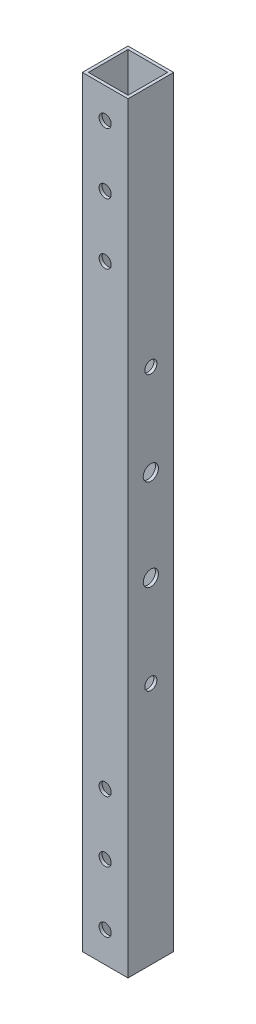
ISO-10303-21;
HEADER;
FILE_DESCRIPTION(('STEP AP214'),'2;1');
FILE_NAME('part.step','',(''),(''),'','','');
FILE_SCHEMA(('AUTOMOTIVE_DESIGN { 1 0 10303 214 1 1 1 1 }'));
ENDSEC;
DATA;
#1=APPLICATION_CONTEXT('core data for automotive mechanical design processes');
#2=APPLICATION_PROTOCOL_DEFINITION('international standard','automotive_design',2000,#1);
#3=PRODUCT_CONTEXT('',#1,'mechanical');
#4=PRODUCT('Part','Part','',(#3));
#5=PRODUCT_RELATED_PRODUCT_CATEGORY('part','',(#4));
#6=PRODUCT_DEFINITION_FORMATION('','',#4);
#7=PRODUCT_DEFINITION_CONTEXT('part definition',#1,'design');
#8=PRODUCT_DEFINITION('design','',#6,#7);
#9=PRODUCT_DEFINITION_SHAPE('','',#8);
#10=(LENGTH_UNIT() NAMED_UNIT(*) SI_UNIT(.MILLI.,.METRE.));
#11=(NAMED_UNIT(*) PLANE_ANGLE_UNIT() SI_UNIT($,.RADIAN.));
#12=(NAMED_UNIT(*) SI_UNIT($,.STERADIAN.) SOLID_ANGLE_UNIT());
#13=UNCERTAINTY_MEASURE_WITH_UNIT(LENGTH_MEASURE(1.E-05),#10,'distance_accuracy_value','');
#14=(GEOMETRIC_REPRESENTATION_CONTEXT(3) GLOBAL_UNCERTAINTY_ASSIGNED_CONTEXT((#13)) GLOBAL_UNIT_ASSIGNED_CONTEXT((#10,
#11,#12)) REPRESENTATION_CONTEXT('',''));
#15=CARTESIAN_POINT('',(0.,0.,0.));
#16=DIRECTION('',(0.,0.,1.));
#17=DIRECTION('',(1.,0.,0.));
#18=AXIS2_PLACEMENT_3D('',#15,#16,#17);
#19=CARTESIAN_POINT('',(0.,250.,0.));
#20=DIRECTION('',(0.,-1.,0.));
#21=DIRECTION('',(0.,0.,-1.));
#22=AXIS2_PLACEMENT_3D('',#19,#20,#21);
#23=PLANE('',#22);
#24=DIRECTION('',(0.,0.,-1.));
#25=VECTOR('',#24,1.);
#26=CARTESIAN_POINT('',(7.5,250.,7.5));
#27=LINE('',#26,#25);
#28=CARTESIAN_POINT('',(7.5,250.,7.5));
#29=VERTEX_POINT('',#28);
#30=CARTESIAN_POINT('',(7.5,250.,-7.5));
#31=VERTEX_POINT('',#30);
#32=EDGE_CURVE('E161',#29,#31,#27,.T.);
#33=ORIENTED_EDGE('',*,*,#32,.T.);
#34=DIRECTION('',(-1.,0.,0.));
#35=VECTOR('',#34,1.);
#36=CARTESIAN_POINT('',(-7.5,250.,-7.5));
#37=LINE('',#36,#35);
#38=CARTESIAN_POINT('',(-7.5,250.,-7.5));
#39=VERTEX_POINT('',#38);
#40=EDGE_CURVE('E165',#31,#39,#37,.T.);
#41=ORIENTED_EDGE('',*,*,#40,.T.);
#42=DIRECTION('',(0.,0.,1.));
#43=VECTOR('',#42,1.);
#44=CARTESIAN_POINT('',(-7.5,250.,7.5));
#45=LINE('',#44,#43);
#46=CARTESIAN_POINT('',(-7.5,250.,7.5));
#47=VERTEX_POINT('',#46);
#48=EDGE_CURVE('E169',#39,#47,#45,.T.);
#49=ORIENTED_EDGE('',*,*,#48,.T.);
#50=DIRECTION('',(1.,0.,0.));
#51=VECTOR('',#50,1.);
#52=CARTESIAN_POINT('',(-7.5,250.,7.5));
#53=LINE('',#52,#51);
#54=EDGE_CURVE('E172',#47,#29,#53,.T.);
#55=ORIENTED_EDGE('',*,*,#54,.T.);
#56=EDGE_LOOP('',(#33,#41,#49,#55));
#57=FACE_BOUND('',#56,.T.);
#58=DIRECTION('',(0.,0.,-1.));
#59=VECTOR('',#58,1.);
#60=CARTESIAN_POINT('',(6.5,250.,6.5));
#61=LINE('',#60,#59);
#62=CARTESIAN_POINT('',(6.5,250.,6.5));
#63=VERTEX_POINT('',#62);
#64=CARTESIAN_POINT('',(6.5,250.,-6.5));
#65=VERTEX_POINT('',#64);
#66=EDGE_CURVE('E111',#63,#65,#61,.T.);
#67=ORIENTED_EDGE('',*,*,#66,.F.);
#68=DIRECTION('',(1.,0.,0.));
#69=VECTOR('',#68,1.);
#70=CARTESIAN_POINT('',(-6.5,250.,6.5));
#71=LINE('',#70,#69);
#72=CARTESIAN_POINT('',(-6.5,250.,6.5));
#73=VERTEX_POINT('',#72);
#74=EDGE_CURVE('E137',#73,#63,#71,.T.);
#75=ORIENTED_EDGE('',*,*,#74,.F.);
#76=DIRECTION('',(0.,0.,1.));
#77=VECTOR('',#76,1.);
#78=CARTESIAN_POINT('',(-6.5,250.,6.5));
#79=LINE('',#78,#77);
#80=CARTESIAN_POINT('',(-6.5,250.,-6.5));
#81=VERTEX_POINT('',#80);
#82=EDGE_CURVE('E133',#81,#73,#79,.T.);
#83=ORIENTED_EDGE('',*,*,#82,.F.);
#84=DIRECTION('',(-1.,0.,0.));
#85=VECTOR('',#84,1.);
#86=CARTESIAN_POINT('',(-6.5,250.,-6.5));
#87=LINE('',#86,#85);
#88=EDGE_CURVE('E120',#65,#81,#87,.T.);
#89=ORIENTED_EDGE('',*,*,#88,.F.);
#90=EDGE_LOOP('',(#67,#75,#83,#89));
#91=FACE_BOUND('',#90,.T.);
#92=ADVANCED_FACE('F43',(#57,#91),#23,.F.);
#93=CARTESIAN_POINT('',(0.,0.,0.));
#94=DIRECTION('',(0.,-1.,0.));
#95=DIRECTION('',(0.,0.,-1.));
#96=AXIS2_PLACEMENT_3D('',#93,#94,#95);
#97=PLANE('',#96);
#98=DIRECTION('',(0.,0.,-1.));
#99=VECTOR('',#98,1.);
#100=CARTESIAN_POINT('',(7.5,0.,7.5));
#101=LINE('',#100,#99);
#102=CARTESIAN_POINT('',(7.5,0.,7.5));
#103=VERTEX_POINT('',#102);
#104=CARTESIAN_POINT('',(7.5,0.,-7.5));
#105=VERTEX_POINT('',#104);
#106=EDGE_CURVE('E129',#103,#105,#101,.T.);
#107=ORIENTED_EDGE('',*,*,#106,.F.);
#108=DIRECTION('',(1.,0.,0.));
#109=VECTOR('',#108,1.);
#110=CARTESIAN_POINT('',(-7.5,0.,7.5));
#111=LINE('',#110,#109);
#112=CARTESIAN_POINT('',(-7.5,0.,7.5));
#113=VERTEX_POINT('',#112);
#114=EDGE_CURVE('E166',#113,#103,#111,.T.);
#115=ORIENTED_EDGE('',*,*,#114,.F.);
#116=DIRECTION('',(0.,0.,1.));
#117=VECTOR('',#116,1.);
#118=CARTESIAN_POINT('',(-7.5,0.,7.5));
#119=LINE('',#118,#117);
#120=CARTESIAN_POINT('',(-7.5,0.,-7.5));
#121=VERTEX_POINT('',#120);
#122=EDGE_CURVE('E182',#121,#113,#119,.T.);
#123=ORIENTED_EDGE('',*,*,#122,.F.);
#124=DIRECTION('',(-1.,0.,0.));
#125=VECTOR('',#124,1.);
#126=CARTESIAN_POINT('',(-7.5,0.,-7.5));
#127=LINE('',#126,#125);
#128=EDGE_CURVE('E179',#105,#121,#127,.T.);
#129=ORIENTED_EDGE('',*,*,#128,.F.);
#130=EDGE_LOOP('',(#107,#115,#123,#129));
#131=FACE_BOUND('',#130,.T.);
#132=DIRECTION('',(1.,0.,0.));
#133=VECTOR('',#132,1.);
#134=CARTESIAN_POINT('',(-6.5,0.,6.5));
#135=LINE('',#134,#133);
#136=CARTESIAN_POINT('',(-6.5,0.,6.5));
#137=VERTEX_POINT('',#136);
#138=CARTESIAN_POINT('',(6.5,0.,6.5));
#139=VERTEX_POINT('',#138);
#140=EDGE_CURVE('E121',#137,#139,#135,.T.);
#141=ORIENTED_EDGE('',*,*,#140,.T.);
#142=DIRECTION('',(0.,0.,-1.));
#143=VECTOR('',#142,1.);
#144=CARTESIAN_POINT('',(6.5,0.,6.5));
#145=LINE('',#144,#143);
#146=CARTESIAN_POINT('',(6.5,0.,-6.5));
#147=VERTEX_POINT('',#146);
#148=EDGE_CURVE('E69',#139,#147,#145,.T.);
#149=ORIENTED_EDGE('',*,*,#148,.T.);
#150=DIRECTION('',(-1.,0.,0.));
#151=VECTOR('',#150,1.);
#152=CARTESIAN_POINT('',(-6.5,0.,-6.5));
#153=LINE('',#152,#151);
#154=CARTESIAN_POINT('',(-6.5,0.,-6.5));
#155=VERTEX_POINT('',#154);
#156=EDGE_CURVE('E127',#147,#155,#153,.T.);
#157=ORIENTED_EDGE('',*,*,#156,.T.);
#158=DIRECTION('',(0.,0.,1.));
#159=VECTOR('',#158,1.);
#160=CARTESIAN_POINT('',(-6.5,0.,6.5));
#161=LINE('',#160,#159);
#162=EDGE_CURVE('E148',#155,#137,#161,.T.);
#163=ORIENTED_EDGE('',*,*,#162,.T.);
#164=EDGE_LOOP('',(#141,#149,#157,#163));
#165=FACE_BOUND('',#164,.T.);
#166=ADVANCED_FACE('F363',(#131,#165),#97,.T.);
#167=CARTESIAN_POINT('',(7.5,250.,7.5));
#168=DIRECTION('',(-1.,0.,0.));
#169=DIRECTION('',(0.,0.,1.));
#170=AXIS2_PLACEMENT_3D('',#167,#168,#169);
#171=PLANE('',#170);
#172=CARTESIAN_POINT('',(7.5,80.,0.));
#173=DIRECTION('',(1.,0.,0.));
#174=DIRECTION('',(0.,0.,1.));
#175=AXIS2_PLACEMENT_3D('',#172,#173,#174);
#176=CIRCLE('',#175,2.);
#177=CARTESIAN_POINT('',(7.5,80.,2.));
#178=VERTEX_POINT('',#177);
#179=EDGE_CURVE('E408',#178,#178,#176,.T.);
#180=ORIENTED_EDGE('',*,*,#179,.F.);
#181=EDGE_LOOP('',(#180));
#182=FACE_BOUND('',#181,.T.);
#183=CARTESIAN_POINT('',(7.5,170.,0.));
#184=DIRECTION('',(1.,0.,0.));
#185=DIRECTION('',(0.,0.,-1.));
#186=AXIS2_PLACEMENT_3D('',#183,#184,#185);
#187=CIRCLE('',#186,2.);
#188=CARTESIAN_POINT('',(7.5,170.,-2.));
#189=VERTEX_POINT('',#188);
#190=EDGE_CURVE('E414',#189,#189,#187,.T.);
#191=ORIENTED_EDGE('',*,*,#190,.F.);
#192=EDGE_LOOP('',(#191));
#193=FACE_BOUND('',#192,.T.);
#194=CARTESIAN_POINT('',(7.5,110.,0.));
#195=DIRECTION('',(1.,0.,0.));
#196=DIRECTION('',(0.,0.,1.));
#197=AXIS2_PLACEMENT_3D('',#194,#195,#196);
#198=CIRCLE('',#197,2.5);
#199=CARTESIAN_POINT('',(7.5,110.,2.5));
#200=VERTEX_POINT('',#199);
#201=EDGE_CURVE('E420',#200,#200,#198,.T.);
#202=ORIENTED_EDGE('',*,*,#201,.F.);
#203=EDGE_LOOP('',(#202));
#204=FACE_BOUND('',#203,.T.);
#205=CARTESIAN_POINT('',(7.5,140.,0.));
#206=DIRECTION('',(1.,0.,0.));
#207=DIRECTION('',(0.,0.,-1.));
#208=AXIS2_PLACEMENT_3D('',#205,#206,#207);
#209=CIRCLE('',#208,2.5);
#210=CARTESIAN_POINT('',(7.5,140.,-2.5));
#211=VERTEX_POINT('',#210);
#212=EDGE_CURVE('E403',#211,#211,#209,.T.);
#213=ORIENTED_EDGE('',*,*,#212,.F.);
#214=EDGE_LOOP('',(#213));
#215=FACE_BOUND('',#214,.T.);
#216=ORIENTED_EDGE('',*,*,#106,.T.);
#217=DIRECTION('',(0.,-1.,0.));
#218=VECTOR('',#217,1.);
#219=CARTESIAN_POINT('',(7.5,250.,-7.5));
#220=LINE('',#219,#218);
#221=EDGE_CURVE('E11',#31,#105,#220,.T.);
#222=ORIENTED_EDGE('',*,*,#221,.F.);
#223=ORIENTED_EDGE('',*,*,#32,.F.);
#224=DIRECTION('',(0.,-1.,0.));
#225=VECTOR('',#224,1.);
#226=CARTESIAN_POINT('',(7.5,250.,7.5));
#227=LINE('',#226,#225);
#228=EDGE_CURVE('E175',#29,#103,#227,.T.);
#229=ORIENTED_EDGE('',*,*,#228,.T.);
#230=EDGE_LOOP('',(#216,#222,#223,#229));
#231=FACE_BOUND('',#230,.T.);
#232=ADVANCED_FACE('F45',(#182,#193,#204,#215,#231),#171,.F.);
#233=CARTESIAN_POINT('',(-7.5,250.,-7.5));
#234=DIRECTION('',(0.,0.,1.));
#235=DIRECTION('',(1.,0.,0.));
#236=AXIS2_PLACEMENT_3D('',#233,#234,#235);
#237=PLANE('',#236);
#238=CARTESIAN_POINT('',(0.,240.,-7.5));
#239=DIRECTION('',(0.,0.,1.));
#240=DIRECTION('',(1.,0.,0.));
#241=AXIS2_PLACEMENT_3D('',#238,#239,#240);
#242=CIRCLE('',#241,2.);
#243=CARTESIAN_POINT('',(1.99999999999998,240.,-7.5));
#244=VERTEX_POINT('',#243);
#245=EDGE_CURVE('E202',#244,#244,#242,.T.);
#246=ORIENTED_EDGE('',*,*,#245,.T.);
#247=EDGE_LOOP('',(#246));
#248=FACE_BOUND('',#247,.T.);
#249=CARTESIAN_POINT('',(0.,50.,-7.5));
#250=DIRECTION('',(0.,0.,1.));
#251=DIRECTION('',(-1.,0.,0.));
#252=AXIS2_PLACEMENT_3D('',#249,#250,#251);
#253=CIRCLE('',#252,2.);
#254=CARTESIAN_POINT('',(-2.00000000000002,50.,-7.5));
#255=VERTEX_POINT('',#254);
#256=EDGE_CURVE('E267',#255,#255,#253,.T.);
#257=ORIENTED_EDGE('',*,*,#256,.T.);
#258=EDGE_LOOP('',(#257));
#259=FACE_BOUND('',#258,.T.);
#260=CARTESIAN_POINT('',(0.,220.,-7.5));
#261=DIRECTION('',(0.,0.,1.));
#262=DIRECTION('',(1.,0.,0.));
#263=AXIS2_PLACEMENT_3D('',#260,#261,#262);
#264=CIRCLE('',#263,2.);
#265=CARTESIAN_POINT('',(1.99999999999998,220.,-7.5));
#266=VERTEX_POINT('',#265);
#267=EDGE_CURVE('E266',#266,#266,#264,.T.);
#268=ORIENTED_EDGE('',*,*,#267,.T.);
#269=EDGE_LOOP('',(#268));
#270=FACE_BOUND('',#269,.T.);
#271=CARTESIAN_POINT('',(0.,30.,-7.5));
#272=DIRECTION('',(0.,0.,1.));
#273=DIRECTION('',(-1.,0.,0.));
#274=AXIS2_PLACEMENT_3D('',#271,#272,#273);
#275=CIRCLE('',#274,2.);
#276=CARTESIAN_POINT('',(-2.,30.,-7.5));
#277=VERTEX_POINT('',#276);
#278=EDGE_CURVE('E298',#277,#277,#275,.T.);
#279=ORIENTED_EDGE('',*,*,#278,.T.);
#280=EDGE_LOOP('',(#279));
#281=FACE_BOUND('',#280,.T.);
#282=CARTESIAN_POINT('',(0.,10.,-7.5));
#283=DIRECTION('',(0.,0.,1.));
#284=DIRECTION('',(-1.,0.,0.));
#285=AXIS2_PLACEMENT_3D('',#282,#283,#284);
#286=CIRCLE('',#285,2.);
#287=CARTESIAN_POINT('',(-2.,10.,-7.5));
#288=VERTEX_POINT('',#287);
#289=EDGE_CURVE('E275',#288,#288,#286,.T.);
#290=ORIENTED_EDGE('',*,*,#289,.T.);
#291=EDGE_LOOP('',(#290));
#292=FACE_BOUND('',#291,.T.);
#293=CARTESIAN_POINT('',(0.,200.,-7.5));
#294=DIRECTION('',(0.,0.,1.));
#295=DIRECTION('',(1.,0.,0.));
#296=AXIS2_PLACEMENT_3D('',#293,#294,#295);
#297=CIRCLE('',#296,2.);
#298=CARTESIAN_POINT('',(1.99999999999998,200.,-7.5));
#299=VERTEX_POINT('',#298);
#300=EDGE_CURVE('E284',#299,#299,#297,.T.);
#301=ORIENTED_EDGE('',*,*,#300,.T.);
#302=EDGE_LOOP('',(#301));
#303=FACE_BOUND('',#302,.T.);
#304=ORIENTED_EDGE('',*,*,#128,.T.);
#305=DIRECTION('',(0.,-1.,0.));
#306=VECTOR('',#305,1.);
#307=CARTESIAN_POINT('',(-7.5,250.,-7.5));
#308=LINE('',#307,#306);
#309=EDGE_CURVE('E53',#39,#121,#308,.T.);
#310=ORIENTED_EDGE('',*,*,#309,.F.);
#311=ORIENTED_EDGE('',*,*,#40,.F.);
#312=ORIENTED_EDGE('',*,*,#221,.T.);
#313=EDGE_LOOP('',(#304,#310,#311,#312));
#314=FACE_BOUND('',#313,.T.);
#315=ADVANCED_FACE('F349',(#248,#259,#270,#281,#292,#303,#314),#237,.F.);
#316=CARTESIAN_POINT('',(-7.5,250.,7.5));
#317=DIRECTION('',(1.,0.,0.));
#318=DIRECTION('',(0.,0.,-1.));
#319=AXIS2_PLACEMENT_3D('',#316,#317,#318);
#320=PLANE('',#319);
#321=CARTESIAN_POINT('',(-7.5,80.,0.));
#322=DIRECTION('',(1.,0.,0.));
#323=DIRECTION('',(0.,0.,1.));
#324=AXIS2_PLACEMENT_3D('',#321,#322,#323);
#325=CIRCLE('',#324,2.);
#326=CARTESIAN_POINT('',(-7.5,80.,2.));
#327=VERTEX_POINT('',#326);
#328=EDGE_CURVE('E390',#327,#327,#325,.T.);
#329=ORIENTED_EDGE('',*,*,#328,.T.);
#330=EDGE_LOOP('',(#329));
#331=FACE_BOUND('',#330,.T.);
#332=CARTESIAN_POINT('',(-7.5,170.,0.));
#333=DIRECTION('',(1.,0.,0.));
#334=DIRECTION('',(0.,0.,-1.));
#335=AXIS2_PLACEMENT_3D('',#332,#333,#334);
#336=CIRCLE('',#335,2.);
#337=CARTESIAN_POINT('',(-7.5,170.,-2.));
#338=VERTEX_POINT('',#337);
#339=EDGE_CURVE('E394',#338,#338,#336,.T.);
#340=ORIENTED_EDGE('',*,*,#339,.T.);
#341=EDGE_LOOP('',(#340));
#342=FACE_BOUND('',#341,.T.);
#343=CARTESIAN_POINT('',(-7.5,110.,0.));
#344=DIRECTION('',(1.,0.,0.));
#345=DIRECTION('',(0.,0.,1.));
#346=AXIS2_PLACEMENT_3D('',#343,#344,#345);
#347=CIRCLE('',#346,2.5);
#348=CARTESIAN_POINT('',(-7.5,110.,2.5));
#349=VERTEX_POINT('',#348);
#350=EDGE_CURVE('E398',#349,#349,#347,.T.);
#351=ORIENTED_EDGE('',*,*,#350,.T.);
#352=EDGE_LOOP('',(#351));
#353=FACE_BOUND('',#352,.T.);
#354=CARTESIAN_POINT('',(-7.5,140.,0.));
#355=DIRECTION('',(1.,0.,0.));
#356=DIRECTION('',(0.,0.,-1.));
#357=AXIS2_PLACEMENT_3D('',#354,#355,#356);
#358=CIRCLE('',#357,2.5);
#359=CARTESIAN_POINT('',(-7.5,140.,-2.5));
#360=VERTEX_POINT('',#359);
#361=EDGE_CURVE('E232',#360,#360,#358,.T.);
#362=ORIENTED_EDGE('',*,*,#361,.T.);
#363=EDGE_LOOP('',(#362));
#364=FACE_BOUND('',#363,.T.);
#365=ORIENTED_EDGE('',*,*,#122,.T.);
#366=DIRECTION('',(0.,-1.,0.));
#367=VECTOR('',#366,1.);
#368=CARTESIAN_POINT('',(-7.5,250.,7.5));
#369=LINE('',#368,#367);
#370=EDGE_CURVE('E190',#47,#113,#369,.T.);
#371=ORIENTED_EDGE('',*,*,#370,.F.);
#372=ORIENTED_EDGE('',*,*,#48,.F.);
#373=ORIENTED_EDGE('',*,*,#309,.T.);
#374=EDGE_LOOP('',(#365,#371,#372,#373));
#375=FACE_BOUND('',#374,.T.);
#376=ADVANCED_FACE('F352',(#331,#342,#353,#364,#375),#320,.F.);
#377=CARTESIAN_POINT('',(-7.5,250.,7.5));
#378=DIRECTION('',(0.,0.,-1.));
#379=DIRECTION('',(-1.,0.,0.));
#380=AXIS2_PLACEMENT_3D('',#377,#378,#379);
#381=PLANE('',#380);
#382=CARTESIAN_POINT('',(0.,240.,7.5));
#383=DIRECTION('',(0.,0.,1.));
#384=DIRECTION('',(1.,0.,0.));
#385=AXIS2_PLACEMENT_3D('',#382,#383,#384);
#386=CIRCLE('',#385,2.);
#387=CARTESIAN_POINT('',(1.99999999999998,240.,7.5));
#388=VERTEX_POINT('',#387);
#389=EDGE_CURVE('E262',#388,#388,#386,.T.);
#390=ORIENTED_EDGE('',*,*,#389,.F.);
#391=EDGE_LOOP('',(#390));
#392=FACE_BOUND('',#391,.T.);
#393=CARTESIAN_POINT('',(0.,50.,7.5));
#394=DIRECTION('',(0.,0.,1.));
#395=DIRECTION('',(-1.,0.,0.));
#396=AXIS2_PLACEMENT_3D('',#393,#394,#395);
#397=CIRCLE('',#396,2.);
#398=CARTESIAN_POINT('',(-2.00000000000002,50.,7.5));
#399=VERTEX_POINT('',#398);
#400=EDGE_CURVE('E258',#399,#399,#397,.T.);
#401=ORIENTED_EDGE('',*,*,#400,.F.);
#402=EDGE_LOOP('',(#401));
#403=FACE_BOUND('',#402,.T.);
#404=CARTESIAN_POINT('',(0.,220.,7.5));
#405=DIRECTION('',(0.,0.,1.));
#406=DIRECTION('',(1.,0.,0.));
#407=AXIS2_PLACEMENT_3D('',#404,#405,#406);
#408=CIRCLE('',#407,2.);
#409=CARTESIAN_POINT('',(1.99999999999998,220.,7.5));
#410=VERTEX_POINT('',#409);
#411=EDGE_CURVE('E294',#410,#410,#408,.T.);
#412=ORIENTED_EDGE('',*,*,#411,.F.);
#413=EDGE_LOOP('',(#412));
#414=FACE_BOUND('',#413,.T.);
#415=CARTESIAN_POINT('',(0.,30.,7.5));
#416=DIRECTION('',(0.,0.,1.));
#417=DIRECTION('',(-1.,0.,0.));
#418=AXIS2_PLACEMENT_3D('',#415,#416,#417);
#419=CIRCLE('',#418,2.);
#420=CARTESIAN_POINT('',(-2.,30.,7.5));
#421=VERTEX_POINT('',#420);
#422=EDGE_CURVE('E279',#421,#421,#419,.T.);
#423=ORIENTED_EDGE('',*,*,#422,.F.);
#424=EDGE_LOOP('',(#423));
#425=FACE_BOUND('',#424,.T.);
#426=CARTESIAN_POINT('',(0.,10.,7.5));
#427=DIRECTION('',(0.,0.,1.));
#428=DIRECTION('',(-1.,0.,0.));
#429=AXIS2_PLACEMENT_3D('',#426,#427,#428);
#430=CIRCLE('',#429,2.);
#431=CARTESIAN_POINT('',(-2.,10.,7.5));
#432=VERTEX_POINT('',#431);
#433=EDGE_CURVE('E280',#432,#432,#430,.T.);
#434=ORIENTED_EDGE('',*,*,#433,.F.);
#435=EDGE_LOOP('',(#434));
#436=FACE_BOUND('',#435,.T.);
#437=CARTESIAN_POINT('',(0.,200.,7.5));
#438=DIRECTION('',(0.,0.,1.));
#439=DIRECTION('',(1.,0.,0.));
#440=AXIS2_PLACEMENT_3D('',#437,#438,#439);
#441=CIRCLE('',#440,2.);
#442=CARTESIAN_POINT('',(1.99999999999998,200.,7.5));
#443=VERTEX_POINT('',#442);
#444=EDGE_CURVE('E271',#443,#443,#441,.T.);
#445=ORIENTED_EDGE('',*,*,#444,.F.);
#446=EDGE_LOOP('',(#445));
#447=FACE_BOUND('',#446,.T.);
#448=ORIENTED_EDGE('',*,*,#114,.T.);
#449=ORIENTED_EDGE('',*,*,#228,.F.);
#450=ORIENTED_EDGE('',*,*,#54,.F.);
#451=ORIENTED_EDGE('',*,*,#370,.T.);
#452=EDGE_LOOP('',(#448,#449,#450,#451));
#453=FACE_BOUND('',#452,.T.);
#454=ADVANCED_FACE('F367',(#392,#403,#414,#425,#436,#447,#453),#381,.F.);
#455=CARTESIAN_POINT('',(6.5,250.,6.5));
#456=DIRECTION('',(-1.,0.,0.));
#457=DIRECTION('',(0.,0.,1.));
#458=AXIS2_PLACEMENT_3D('',#455,#456,#457);
#459=PLANE('',#458);
#460=CARTESIAN_POINT('',(6.5,80.,0.));
#461=DIRECTION('',(-1.,0.,0.));
#462=DIRECTION('',(0.,0.,1.));
#463=AXIS2_PLACEMENT_3D('',#460,#461,#462);
#464=CIRCLE('',#463,2.);
#465=CARTESIAN_POINT('',(6.5,80.,2.));
#466=VERTEX_POINT('',#465);
#467=EDGE_CURVE('E254',#466,#466,#464,.T.);
#468=ORIENTED_EDGE('',*,*,#467,.F.);
#469=EDGE_LOOP('',(#468));
#470=FACE_BOUND('',#469,.T.);
#471=CARTESIAN_POINT('',(6.5,170.,0.));
#472=DIRECTION('',(-1.,0.,0.));
#473=DIRECTION('',(0.,0.,1.));
#474=AXIS2_PLACEMENT_3D('',#471,#472,#473);
#475=CIRCLE('',#474,2.);
#476=CARTESIAN_POINT('',(6.5,170.,2.));
#477=VERTEX_POINT('',#476);
#478=EDGE_CURVE('E240',#477,#477,#475,.T.);
#479=ORIENTED_EDGE('',*,*,#478,.F.);
#480=EDGE_LOOP('',(#479));
#481=FACE_BOUND('',#480,.T.);
#482=CARTESIAN_POINT('',(6.5,110.,0.));
#483=DIRECTION('',(-1.,0.,0.));
#484=DIRECTION('',(0.,0.,1.));
#485=AXIS2_PLACEMENT_3D('',#482,#483,#484);
#486=CIRCLE('',#485,2.5);
#487=CARTESIAN_POINT('',(6.5,110.,2.5));
#488=VERTEX_POINT('',#487);
#489=EDGE_CURVE('E236',#488,#488,#486,.T.);
#490=ORIENTED_EDGE('',*,*,#489,.F.);
#491=EDGE_LOOP('',(#490));
#492=FACE_BOUND('',#491,.T.);
#493=CARTESIAN_POINT('',(6.5,140.,0.));
#494=DIRECTION('',(-1.,0.,0.));
#495=DIRECTION('',(0.,0.,1.));
#496=AXIS2_PLACEMENT_3D('',#493,#494,#495);
#497=CIRCLE('',#496,2.5);
#498=CARTESIAN_POINT('',(6.5,140.,2.5));
#499=VERTEX_POINT('',#498);
#500=EDGE_CURVE('E231',#499,#499,#497,.T.);
#501=ORIENTED_EDGE('',*,*,#500,.F.);
#502=EDGE_LOOP('',(#501));
#503=FACE_BOUND('',#502,.T.);
#504=ORIENTED_EDGE('',*,*,#148,.F.);
#505=DIRECTION('',(0.,-1.,0.));
#506=VECTOR('',#505,1.);
#507=CARTESIAN_POINT('',(6.5,250.,6.5));
#508=LINE('',#507,#506);
#509=EDGE_CURVE('E115',#63,#139,#508,.T.);
#510=ORIENTED_EDGE('',*,*,#509,.F.);
#511=ORIENTED_EDGE('',*,*,#66,.T.);
#512=DIRECTION('',(0.,-1.,0.));
#513=VECTOR('',#512,1.);
#514=CARTESIAN_POINT('',(6.5,250.,-6.5));
#515=LINE('',#514,#513);
#516=EDGE_CURVE('E114',#65,#147,#515,.T.);
#517=ORIENTED_EDGE('',*,*,#516,.T.);
#518=EDGE_LOOP('',(#504,#510,#511,#517));
#519=FACE_BOUND('',#518,.T.);
#520=ADVANCED_FACE('F113',(#470,#481,#492,#503,#519),#459,.T.);
#521=CARTESIAN_POINT('',(-6.5,250.,-6.5));
#522=DIRECTION('',(0.,0.,1.));
#523=DIRECTION('',(1.,0.,0.));
#524=AXIS2_PLACEMENT_3D('',#521,#522,#523);
#525=PLANE('',#524);
#526=CARTESIAN_POINT('',(0.,240.,-6.5));
#527=DIRECTION('',(0.,0.,1.));
#528=DIRECTION('',(1.,0.,0.));
#529=AXIS2_PLACEMENT_3D('',#526,#527,#528);
#530=CIRCLE('',#529,2.);
#531=CARTESIAN_POINT('',(1.99999999999998,240.,-6.5));
#532=VERTEX_POINT('',#531);
#533=EDGE_CURVE('E145',#532,#532,#530,.T.);
#534=ORIENTED_EDGE('',*,*,#533,.F.);
#535=EDGE_LOOP('',(#534));
#536=FACE_BOUND('',#535,.T.);
#537=CARTESIAN_POINT('',(0.,50.,-6.5));
#538=DIRECTION('',(0.,0.,1.));
#539=DIRECTION('',(1.,0.,0.));
#540=AXIS2_PLACEMENT_3D('',#537,#538,#539);
#541=CIRCLE('',#540,2.);
#542=CARTESIAN_POINT('',(1.99999999999998,50.,-6.5));
#543=VERTEX_POINT('',#542);
#544=EDGE_CURVE('E222',#543,#543,#541,.T.);
#545=ORIENTED_EDGE('',*,*,#544,.F.);
#546=EDGE_LOOP('',(#545));
#547=FACE_BOUND('',#546,.T.);
#548=CARTESIAN_POINT('',(0.,220.,-6.5));
#549=DIRECTION('',(0.,0.,1.));
#550=DIRECTION('',(1.,0.,0.));
#551=AXIS2_PLACEMENT_3D('',#548,#549,#550);
#552=CIRCLE('',#551,2.);
#553=CARTESIAN_POINT('',(1.99999999999998,220.,-6.5));
#554=VERTEX_POINT('',#553);
#555=EDGE_CURVE('E217',#554,#554,#552,.T.);
#556=ORIENTED_EDGE('',*,*,#555,.F.);
#557=EDGE_LOOP('',(#556));
#558=FACE_BOUND('',#557,.T.);
#559=CARTESIAN_POINT('',(0.,30.,-6.5));
#560=DIRECTION('',(0.,0.,1.));
#561=DIRECTION('',(1.,0.,0.));
#562=AXIS2_PLACEMENT_3D('',#559,#560,#561);
#563=CIRCLE('',#562,2.);
#564=CARTESIAN_POINT('',(2.,30.,-6.5));
#565=VERTEX_POINT('',#564);
#566=EDGE_CURVE('E212',#565,#565,#563,.T.);
#567=ORIENTED_EDGE('',*,*,#566,.F.);
#568=EDGE_LOOP('',(#567));
#569=FACE_BOUND('',#568,.T.);
#570=CARTESIAN_POINT('',(0.,10.,-6.5));
#571=DIRECTION('',(0.,0.,1.));
#572=DIRECTION('',(1.,0.,0.));
#573=AXIS2_PLACEMENT_3D('',#570,#571,#572);
#574=CIRCLE('',#573,2.);
#575=CARTESIAN_POINT('',(2.00000000000001,10.,-6.5));
#576=VERTEX_POINT('',#575);
#577=EDGE_CURVE('E207',#576,#576,#574,.T.);
#578=ORIENTED_EDGE('',*,*,#577,.F.);
#579=EDGE_LOOP('',(#578));
#580=FACE_BOUND('',#579,.T.);
#581=CARTESIAN_POINT('',(0.,200.,-6.5));
#582=DIRECTION('',(0.,0.,1.));
#583=DIRECTION('',(1.,0.,0.));
#584=AXIS2_PLACEMENT_3D('',#581,#582,#583);
#585=CIRCLE('',#584,2.);
#586=CARTESIAN_POINT('',(1.99999999999998,200.,-6.5));
#587=VERTEX_POINT('',#586);
#588=EDGE_CURVE('E201',#587,#587,#585,.T.);
#589=ORIENTED_EDGE('',*,*,#588,.F.);
#590=EDGE_LOOP('',(#589));
#591=FACE_BOUND('',#590,.T.);
#592=ORIENTED_EDGE('',*,*,#156,.F.);
#593=ORIENTED_EDGE('',*,*,#516,.F.);
#594=ORIENTED_EDGE('',*,*,#88,.T.);
#595=DIRECTION('',(0.,-1.,0.));
#596=VECTOR('',#595,1.);
#597=CARTESIAN_POINT('',(-6.5,250.,-6.5));
#598=LINE('',#597,#596);
#599=EDGE_CURVE('E130',#81,#155,#598,.T.);
#600=ORIENTED_EDGE('',*,*,#599,.T.);
#601=EDGE_LOOP('',(#592,#593,#594,#600));
#602=FACE_BOUND('',#601,.T.);
#603=ADVANCED_FACE('F124',(#536,#547,#558,#569,#580,#591,#602),#525,.T.);
#604=CARTESIAN_POINT('',(-6.5,250.,6.5));
#605=DIRECTION('',(1.,0.,0.));
#606=DIRECTION('',(0.,0.,-1.));
#607=AXIS2_PLACEMENT_3D('',#604,#605,#606);
#608=PLANE('',#607);
#609=CARTESIAN_POINT('',(-6.5,80.,0.));
#610=DIRECTION('',(1.,0.,0.));
#611=DIRECTION('',(0.,0.,-1.));
#612=AXIS2_PLACEMENT_3D('',#609,#610,#611);
#613=CIRCLE('',#612,2.);
#614=CARTESIAN_POINT('',(-6.5,80.,-2.));
#615=VERTEX_POINT('',#614);
#616=EDGE_CURVE('E47',#615,#615,#613,.T.);
#617=ORIENTED_EDGE('',*,*,#616,.F.);
#618=EDGE_LOOP('',(#617));
#619=FACE_BOUND('',#618,.T.);
#620=CARTESIAN_POINT('',(-6.5,170.,0.));
#621=DIRECTION('',(1.,0.,0.));
#622=DIRECTION('',(0.,0.,-1.));
#623=AXIS2_PLACEMENT_3D('',#620,#621,#622);
#624=CIRCLE('',#623,2.);
#625=CARTESIAN_POINT('',(-6.5,170.,-2.));
#626=VERTEX_POINT('',#625);
#627=EDGE_CURVE('E237',#626,#626,#624,.T.);
#628=ORIENTED_EDGE('',*,*,#627,.F.);
#629=EDGE_LOOP('',(#628));
#630=FACE_BOUND('',#629,.T.);
#631=CARTESIAN_POINT('',(-6.5,110.,0.));
#632=DIRECTION('',(1.,0.,0.));
#633=DIRECTION('',(0.,0.,-1.));
#634=AXIS2_PLACEMENT_3D('',#631,#632,#633);
#635=CIRCLE('',#634,2.5);
#636=CARTESIAN_POINT('',(-6.5,110.,-2.5));
#637=VERTEX_POINT('',#636);
#638=EDGE_CURVE('E233',#637,#637,#635,.T.);
#639=ORIENTED_EDGE('',*,*,#638,.F.);
#640=EDGE_LOOP('',(#639));
#641=FACE_BOUND('',#640,.T.);
#642=CARTESIAN_POINT('',(-6.5,140.,0.));
#643=DIRECTION('',(1.,0.,0.));
#644=DIRECTION('',(0.,0.,-1.));
#645=AXIS2_PLACEMENT_3D('',#642,#643,#644);
#646=CIRCLE('',#645,2.5);
#647=CARTESIAN_POINT('',(-6.5,140.,-2.5));
#648=VERTEX_POINT('',#647);
#649=EDGE_CURVE('E227',#648,#648,#646,.T.);
#650=ORIENTED_EDGE('',*,*,#649,.F.);
#651=EDGE_LOOP('',(#650));
#652=FACE_BOUND('',#651,.T.);
#653=ORIENTED_EDGE('',*,*,#162,.F.);
#654=ORIENTED_EDGE('',*,*,#599,.F.);
#655=ORIENTED_EDGE('',*,*,#82,.T.);
#656=DIRECTION('',(0.,-1.,0.));
#657=VECTOR('',#656,1.);
#658=CARTESIAN_POINT('',(-6.5,250.,6.5));
#659=LINE('',#658,#657);
#660=EDGE_CURVE('E61',#73,#137,#659,.T.);
#661=ORIENTED_EDGE('',*,*,#660,.T.);
#662=EDGE_LOOP('',(#653,#654,#655,#661));
#663=FACE_BOUND('',#662,.T.);
#664=ADVANCED_FACE('F328',(#619,#630,#641,#652,#663),#608,.T.);
#665=CARTESIAN_POINT('',(-6.5,250.,6.5));
#666=DIRECTION('',(0.,0.,-1.));
#667=DIRECTION('',(-1.,0.,0.));
#668=AXIS2_PLACEMENT_3D('',#665,#666,#667);
#669=PLANE('',#668);
#670=CARTESIAN_POINT('',(0.,240.,6.5));
#671=DIRECTION('',(0.,0.,-1.));
#672=DIRECTION('',(-1.,0.,0.));
#673=AXIS2_PLACEMENT_3D('',#670,#671,#672);
#674=CIRCLE('',#673,2.);
#675=CARTESIAN_POINT('',(-2.00000000000003,240.,6.5));
#676=VERTEX_POINT('',#675);
#677=EDGE_CURVE('E223',#676,#676,#674,.T.);
#678=ORIENTED_EDGE('',*,*,#677,.F.);
#679=EDGE_LOOP('',(#678));
#680=FACE_BOUND('',#679,.T.);
#681=CARTESIAN_POINT('',(0.,50.,6.5));
#682=DIRECTION('',(0.,0.,-1.));
#683=DIRECTION('',(-1.,0.,0.));
#684=AXIS2_PLACEMENT_3D('',#681,#682,#683);
#685=CIRCLE('',#684,2.);
#686=CARTESIAN_POINT('',(-2.00000000000002,50.,6.5));
#687=VERTEX_POINT('',#686);
#688=EDGE_CURVE('E218',#687,#687,#685,.T.);
#689=ORIENTED_EDGE('',*,*,#688,.F.);
#690=EDGE_LOOP('',(#689));
#691=FACE_BOUND('',#690,.T.);
#692=CARTESIAN_POINT('',(0.,220.,6.5));
#693=DIRECTION('',(0.,0.,-1.));
#694=DIRECTION('',(-1.,0.,0.));
#695=AXIS2_PLACEMENT_3D('',#692,#693,#694);
#696=CIRCLE('',#695,2.);
#697=CARTESIAN_POINT('',(-2.00000000000002,220.,6.5));
#698=VERTEX_POINT('',#697);
#699=EDGE_CURVE('E213',#698,#698,#696,.T.);
#700=ORIENTED_EDGE('',*,*,#699,.F.);
#701=EDGE_LOOP('',(#700));
#702=FACE_BOUND('',#701,.T.);
#703=CARTESIAN_POINT('',(0.,30.,6.5));
#704=DIRECTION('',(0.,0.,-1.));
#705=DIRECTION('',(-1.,0.,0.));
#706=AXIS2_PLACEMENT_3D('',#703,#704,#705);
#707=CIRCLE('',#706,2.);
#708=CARTESIAN_POINT('',(-2.,30.,6.5));
#709=VERTEX_POINT('',#708);
#710=EDGE_CURVE('E208',#709,#709,#707,.T.);
#711=ORIENTED_EDGE('',*,*,#710,.F.);
#712=EDGE_LOOP('',(#711));
#713=FACE_BOUND('',#712,.T.);
#714=CARTESIAN_POINT('',(0.,10.,6.5));
#715=DIRECTION('',(0.,0.,-1.));
#716=DIRECTION('',(-1.,0.,0.));
#717=AXIS2_PLACEMENT_3D('',#714,#715,#716);
#718=CIRCLE('',#717,2.);
#719=CARTESIAN_POINT('',(-2.,10.,6.5));
#720=VERTEX_POINT('',#719);
#721=EDGE_CURVE('E203',#720,#720,#718,.T.);
#722=ORIENTED_EDGE('',*,*,#721,.F.);
#723=EDGE_LOOP('',(#722));
#724=FACE_BOUND('',#723,.T.);
#725=CARTESIAN_POINT('',(0.,200.,6.5));
#726=DIRECTION('',(0.,0.,-1.));
#727=DIRECTION('',(-1.,0.,0.));
#728=AXIS2_PLACEMENT_3D('',#725,#726,#727);
#729=CIRCLE('',#728,2.);
#730=CARTESIAN_POINT('',(-2.00000000000002,200.,6.5));
#731=VERTEX_POINT('',#730);
#732=EDGE_CURVE('E197',#731,#731,#729,.T.);
#733=ORIENTED_EDGE('',*,*,#732,.F.);
#734=EDGE_LOOP('',(#733));
#735=FACE_BOUND('',#734,.T.);
#736=ORIENTED_EDGE('',*,*,#140,.F.);
#737=ORIENTED_EDGE('',*,*,#660,.F.);
#738=ORIENTED_EDGE('',*,*,#74,.T.);
#739=ORIENTED_EDGE('',*,*,#509,.T.);
#740=EDGE_LOOP('',(#736,#737,#738,#739));
#741=FACE_BOUND('',#740,.T.);
#742=ADVANCED_FACE('F465',(#680,#691,#702,#713,#724,#735,#741),#669,.T.);
#743=CARTESIAN_POINT('',(0.,200.,-7.5));
#744=DIRECTION('',(0.,0.,1.));
#745=DIRECTION('',(1.,0.,0.));
#746=AXIS2_PLACEMENT_3D('',#743,#744,#745);
#747=CYLINDRICAL_SURFACE('',#746,2.);
#748=ORIENTED_EDGE('',*,*,#732,.T.);
#749=EDGE_LOOP('',(#748));
#750=FACE_BOUND('',#749,.T.);
#751=ORIENTED_EDGE('',*,*,#444,.T.);
#752=EDGE_LOOP('',(#751));
#753=FACE_BOUND('',#752,.T.);
#754=ADVANCED_FACE('F346',(#750,#753),#747,.F.);
#755=CARTESIAN_POINT('',(0.,10.,-7.5));
#756=DIRECTION('',(0.,0.,1.));
#757=DIRECTION('',(1.,0.,0.));
#758=AXIS2_PLACEMENT_3D('',#755,#756,#757);
#759=CYLINDRICAL_SURFACE('',#758,2.);
#760=ORIENTED_EDGE('',*,*,#721,.T.);
#761=EDGE_LOOP('',(#760));
#762=FACE_BOUND('',#761,.T.);
#763=ORIENTED_EDGE('',*,*,#433,.T.);
#764=EDGE_LOOP('',(#763));
#765=FACE_BOUND('',#764,.T.);
#766=ADVANCED_FACE('F475',(#762,#765),#759,.F.);
#767=CARTESIAN_POINT('',(0.,30.,-7.5));
#768=DIRECTION('',(0.,0.,1.));
#769=DIRECTION('',(1.,0.,0.));
#770=AXIS2_PLACEMENT_3D('',#767,#768,#769);
#771=CYLINDRICAL_SURFACE('',#770,2.);
#772=ORIENTED_EDGE('',*,*,#710,.T.);
#773=EDGE_LOOP('',(#772));
#774=FACE_BOUND('',#773,.T.);
#775=ORIENTED_EDGE('',*,*,#422,.T.);
#776=EDGE_LOOP('',(#775));
#777=FACE_BOUND('',#776,.T.);
#778=ADVANCED_FACE('F480',(#774,#777),#771,.F.);
#779=CARTESIAN_POINT('',(0.,220.,-7.5));
#780=DIRECTION('',(0.,0.,1.));
#781=DIRECTION('',(1.,0.,0.));
#782=AXIS2_PLACEMENT_3D('',#779,#780,#781);
#783=CYLINDRICAL_SURFACE('',#782,2.);
#784=ORIENTED_EDGE('',*,*,#699,.T.);
#785=EDGE_LOOP('',(#784));
#786=FACE_BOUND('',#785,.T.);
#787=ORIENTED_EDGE('',*,*,#411,.T.);
#788=EDGE_LOOP('',(#787));
#789=FACE_BOUND('',#788,.T.);
#790=ADVANCED_FACE('F483',(#786,#789),#783,.F.);
#791=CARTESIAN_POINT('',(0.,50.,-7.5));
#792=DIRECTION('',(0.,0.,1.));
#793=DIRECTION('',(1.,0.,0.));
#794=AXIS2_PLACEMENT_3D('',#791,#792,#793);
#795=CYLINDRICAL_SURFACE('',#794,2.);
#796=ORIENTED_EDGE('',*,*,#688,.T.);
#797=EDGE_LOOP('',(#796));
#798=FACE_BOUND('',#797,.T.);
#799=ORIENTED_EDGE('',*,*,#400,.T.);
#800=EDGE_LOOP('',(#799));
#801=FACE_BOUND('',#800,.T.);
#802=ADVANCED_FACE('F487',(#798,#801),#795,.F.);
#803=CARTESIAN_POINT('',(0.,240.,-7.5));
#804=DIRECTION('',(0.,0.,1.));
#805=DIRECTION('',(1.,0.,0.));
#806=AXIS2_PLACEMENT_3D('',#803,#804,#805);
#807=CYLINDRICAL_SURFACE('',#806,2.);
#808=ORIENTED_EDGE('',*,*,#677,.T.);
#809=EDGE_LOOP('',(#808));
#810=FACE_BOUND('',#809,.T.);
#811=ORIENTED_EDGE('',*,*,#389,.T.);
#812=EDGE_LOOP('',(#811));
#813=FACE_BOUND('',#812,.T.);
#814=ADVANCED_FACE('F344',(#810,#813),#807,.F.);
#815=ORIENTED_EDGE('',*,*,#588,.T.);
#816=EDGE_LOOP('',(#815));
#817=FACE_BOUND('',#816,.T.);
#818=ORIENTED_EDGE('',*,*,#300,.F.);
#819=EDGE_LOOP('',(#818));
#820=FACE_BOUND('',#819,.T.);
#821=ADVANCED_FACE('F340',(#817,#820),#747,.F.);
#822=ORIENTED_EDGE('',*,*,#577,.T.);
#823=EDGE_LOOP('',(#822));
#824=FACE_BOUND('',#823,.T.);
#825=ORIENTED_EDGE('',*,*,#289,.F.);
#826=EDGE_LOOP('',(#825));
#827=FACE_BOUND('',#826,.T.);
#828=ADVANCED_FACE('F343',(#824,#827),#759,.F.);
#829=ORIENTED_EDGE('',*,*,#566,.T.);
#830=EDGE_LOOP('',(#829));
#831=FACE_BOUND('',#830,.T.);
#832=ORIENTED_EDGE('',*,*,#278,.F.);
#833=EDGE_LOOP('',(#832));
#834=FACE_BOUND('',#833,.T.);
#835=ADVANCED_FACE('F485',(#831,#834),#771,.F.);
#836=ORIENTED_EDGE('',*,*,#555,.T.);
#837=EDGE_LOOP('',(#836));
#838=FACE_BOUND('',#837,.T.);
#839=ORIENTED_EDGE('',*,*,#267,.F.);
#840=EDGE_LOOP('',(#839));
#841=FACE_BOUND('',#840,.T.);
#842=ADVANCED_FACE('F489',(#838,#841),#783,.F.);
#843=ORIENTED_EDGE('',*,*,#544,.T.);
#844=EDGE_LOOP('',(#843));
#845=FACE_BOUND('',#844,.T.);
#846=ORIENTED_EDGE('',*,*,#256,.F.);
#847=EDGE_LOOP('',(#846));
#848=FACE_BOUND('',#847,.T.);
#849=ADVANCED_FACE('F460',(#845,#848),#795,.F.);
#850=ORIENTED_EDGE('',*,*,#533,.T.);
#851=EDGE_LOOP('',(#850));
#852=FACE_BOUND('',#851,.T.);
#853=ORIENTED_EDGE('',*,*,#245,.F.);
#854=EDGE_LOOP('',(#853));
#855=FACE_BOUND('',#854,.T.);
#856=ADVANCED_FACE('F323',(#852,#855),#807,.F.);
#857=CARTESIAN_POINT('',(-7.5,140.,0.));
#858=DIRECTION('',(1.,0.,0.));
#859=DIRECTION('',(0.,0.,-1.));
#860=AXIS2_PLACEMENT_3D('',#857,#858,#859);
#861=CYLINDRICAL_SURFACE('',#860,2.5);
#862=ORIENTED_EDGE('',*,*,#649,.T.);
#863=EDGE_LOOP('',(#862));
#864=FACE_BOUND('',#863,.T.);
#865=ORIENTED_EDGE('',*,*,#361,.F.);
#866=EDGE_LOOP('',(#865));
#867=FACE_BOUND('',#866,.T.);
#868=ADVANCED_FACE('F439',(#864,#867),#861,.F.);
#869=CARTESIAN_POINT('',(-7.5,110.,0.));
#870=DIRECTION('',(1.,0.,0.));
#871=DIRECTION('',(0.,0.,-1.));
#872=AXIS2_PLACEMENT_3D('',#869,#870,#871);
#873=CYLINDRICAL_SURFACE('',#872,2.5);
#874=ORIENTED_EDGE('',*,*,#638,.T.);
#875=EDGE_LOOP('',(#874));
#876=FACE_BOUND('',#875,.T.);
#877=ORIENTED_EDGE('',*,*,#350,.F.);
#878=EDGE_LOOP('',(#877));
#879=FACE_BOUND('',#878,.T.);
#880=ADVANCED_FACE('F446',(#876,#879),#873,.F.);
#881=CARTESIAN_POINT('',(-7.5,170.,0.));
#882=DIRECTION('',(1.,0.,0.));
#883=DIRECTION('',(0.,0.,-1.));
#884=AXIS2_PLACEMENT_3D('',#881,#882,#883);
#885=CYLINDRICAL_SURFACE('',#884,2.);
#886=ORIENTED_EDGE('',*,*,#627,.T.);
#887=EDGE_LOOP('',(#886));
#888=FACE_BOUND('',#887,.T.);
#889=ORIENTED_EDGE('',*,*,#339,.F.);
#890=EDGE_LOOP('',(#889));
#891=FACE_BOUND('',#890,.T.);
#892=ADVANCED_FACE('F447',(#888,#891),#885,.F.);
#893=CARTESIAN_POINT('',(-7.5,80.,0.));
#894=DIRECTION('',(1.,0.,0.));
#895=DIRECTION('',(0.,0.,-1.));
#896=AXIS2_PLACEMENT_3D('',#893,#894,#895);
#897=CYLINDRICAL_SURFACE('',#896,2.);
#898=ORIENTED_EDGE('',*,*,#616,.T.);
#899=EDGE_LOOP('',(#898));
#900=FACE_BOUND('',#899,.T.);
#901=ORIENTED_EDGE('',*,*,#328,.F.);
#902=EDGE_LOOP('',(#901));
#903=FACE_BOUND('',#902,.T.);
#904=ADVANCED_FACE('F436',(#900,#903),#897,.F.);
#905=ORIENTED_EDGE('',*,*,#500,.T.);
#906=EDGE_LOOP('',(#905));
#907=FACE_BOUND('',#906,.T.);
#908=ORIENTED_EDGE('',*,*,#212,.T.);
#909=EDGE_LOOP('',(#908));
#910=FACE_BOUND('',#909,.T.);
#911=ADVANCED_FACE('F434',(#907,#910),#861,.F.);
#912=ORIENTED_EDGE('',*,*,#489,.T.);
#913=EDGE_LOOP('',(#912));
#914=FACE_BOUND('',#913,.T.);
#915=ORIENTED_EDGE('',*,*,#201,.T.);
#916=EDGE_LOOP('',(#915));
#917=FACE_BOUND('',#916,.T.);
#918=ADVANCED_FACE('F427',(#914,#917),#873,.F.);
#919=ORIENTED_EDGE('',*,*,#478,.T.);
#920=EDGE_LOOP('',(#919));
#921=FACE_BOUND('',#920,.T.);
#922=ORIENTED_EDGE('',*,*,#190,.T.);
#923=EDGE_LOOP('',(#922));
#924=FACE_BOUND('',#923,.T.);
#925=ADVANCED_FACE('F444',(#921,#924),#885,.F.);
#926=ORIENTED_EDGE('',*,*,#467,.T.);
#927=EDGE_LOOP('',(#926));
#928=FACE_BOUND('',#927,.T.);
#929=ORIENTED_EDGE('',*,*,#179,.T.);
#930=EDGE_LOOP('',(#929));
#931=FACE_BOUND('',#930,.T.);
#932=ADVANCED_FACE('F450',(#928,#931),#897,.F.);
#933=CLOSED_SHELL('',(#92,#166,#232,#315,#376,#454,#520,#603,#664,#742,#754,#766,#778,#790,#802,
#814,#821,#828,#835,#842,#849,#856,#868,#880,#892,#904,#911,#918,#925,#932));
#934=MANIFOLD_SOLID_BREP('B2',#933);
#935=ADVANCED_BREP_SHAPE_REPRESENTATION('',(#18,#934),#14);
#936=SHAPE_DEFINITION_REPRESENTATION(#9,#935);
ENDSEC;
END-ISO-10303-21;
